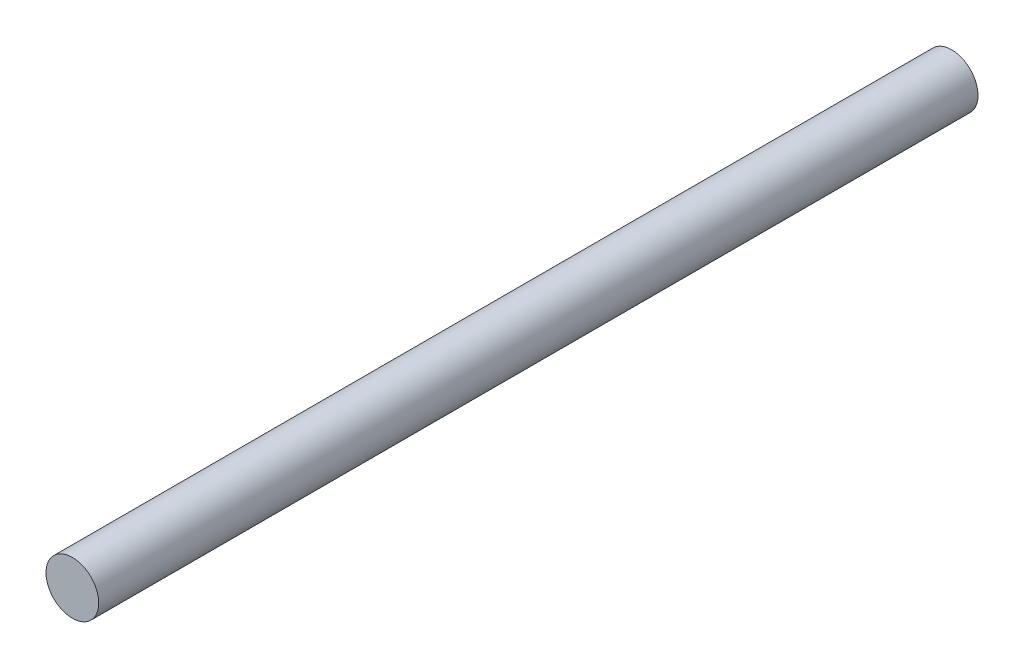
ISO-10303-21;
HEADER;
FILE_DESCRIPTION(('STEP AP214'),'2;1');
FILE_NAME('part.step','',(''),(''),'','','');
FILE_SCHEMA(('AUTOMOTIVE_DESIGN { 1 0 10303 214 1 1 1 1 }'));
ENDSEC;
DATA;
#1=APPLICATION_CONTEXT('core data for automotive mechanical design processes');
#2=APPLICATION_PROTOCOL_DEFINITION('international standard','automotive_design',2000,#1);
#3=PRODUCT_CONTEXT('',#1,'mechanical');
#4=PRODUCT('Part','Part','',(#3));
#5=PRODUCT_RELATED_PRODUCT_CATEGORY('part','',(#4));
#6=PRODUCT_DEFINITION_FORMATION('','',#4);
#7=PRODUCT_DEFINITION_CONTEXT('part definition',#1,'design');
#8=PRODUCT_DEFINITION('design','',#6,#7);
#9=PRODUCT_DEFINITION_SHAPE('','',#8);
#10=(LENGTH_UNIT() NAMED_UNIT(*) SI_UNIT(.MILLI.,.METRE.));
#11=(NAMED_UNIT(*) PLANE_ANGLE_UNIT() SI_UNIT($,.RADIAN.));
#12=(NAMED_UNIT(*) SI_UNIT($,.STERADIAN.) SOLID_ANGLE_UNIT());
#13=UNCERTAINTY_MEASURE_WITH_UNIT(LENGTH_MEASURE(1.E-05),#10,'distance_accuracy_value','');
#14=(GEOMETRIC_REPRESENTATION_CONTEXT(3) GLOBAL_UNCERTAINTY_ASSIGNED_CONTEXT((#13)) GLOBAL_UNIT_ASSIGNED_CONTEXT((#10,
#11,#12)) REPRESENTATION_CONTEXT('',''));
#15=CARTESIAN_POINT('',(0.,0.,0.));
#16=DIRECTION('',(0.,0.,1.));
#17=DIRECTION('',(1.,0.,0.));
#18=AXIS2_PLACEMENT_3D('',#15,#16,#17);
#19=CARTESIAN_POINT('',(4.70803951380108E-12,8.44983805148306E-12,-1458.08355766447));
#20=DIRECTION('',(0.,0.,1.));
#21=DIRECTION('',(0.,-1.,0.));
#22=AXIS2_PLACEMENT_3D('',#19,#20,#21);
#23=CYLINDRICAL_SURFACE('',#22,0.750000000002035);
#24=CARTESIAN_POINT('',(4.70803951380108E-12,8.44983805148306E-12,-1458.08355766447));
#25=DIRECTION('',(0.,0.,-1.));
#26=DIRECTION('',(0.,1.,0.));
#27=AXIS2_PLACEMENT_3D('',#24,#25,#26);
#28=CIRCLE('',#27,0.750000000002035);
#29=CARTESIAN_POINT('',(4.70803951380108E-12,0.750000000010485,-1458.08355766447));
#30=VERTEX_POINT('',#29);
#31=EDGE_CURVE('E10',#30,#30,#28,.T.);
#32=ORIENTED_EDGE('',*,*,#31,.F.);
#33=EDGE_LOOP('',(#32));
#34=FACE_BOUND('',#33,.T.);
#35=CARTESIAN_POINT('',(4.70803951380108E-12,8.44983805148306E-12,-1433.08355766447));
#36=DIRECTION('',(0.,0.,-1.));
#37=DIRECTION('',(0.,1.,0.));
#38=AXIS2_PLACEMENT_3D('',#35,#36,#37);
#39=CIRCLE('',#38,0.750000000002035);
#40=CARTESIAN_POINT('',(4.70803951380108E-12,0.750000000010485,-1433.08355766447));
#41=VERTEX_POINT('',#40);
#42=EDGE_CURVE('E34',#41,#41,#39,.T.);
#43=ORIENTED_EDGE('',*,*,#42,.T.);
#44=EDGE_LOOP('',(#43));
#45=FACE_BOUND('',#44,.T.);
#46=ADVANCED_FACE('F31',(#34,#45),#23,.T.);
#47=CARTESIAN_POINT('',(4.70803951380108E-12,8.44983805148306E-12,-1458.08355766447));
#48=DIRECTION('',(0.,0.,-1.));
#49=DIRECTION('',(0.,1.,0.));
#50=AXIS2_PLACEMENT_3D('',#47,#48,#49);
#51=PLANE('',#50);
#52=ORIENTED_EDGE('',*,*,#31,.T.);
#53=EDGE_LOOP('',(#52));
#54=FACE_BOUND('',#53,.T.);
#55=ADVANCED_FACE('F46',(#54),#51,.T.);
#56=CARTESIAN_POINT('',(4.70803951380108E-12,8.44983805148306E-12,-1433.08355766447));
#57=DIRECTION('',(0.,0.,-1.));
#58=DIRECTION('',(0.,1.,0.));
#59=AXIS2_PLACEMENT_3D('',#56,#57,#58);
#60=PLANE('',#59);
#61=ORIENTED_EDGE('',*,*,#42,.F.);
#62=EDGE_LOOP('',(#61));
#63=FACE_BOUND('',#62,.T.);
#64=ADVANCED_FACE('F44',(#63),#60,.F.);
#65=CLOSED_SHELL('',(#46,#55,#64));
#66=MANIFOLD_SOLID_BREP('B2',#65);
#67=ADVANCED_BREP_SHAPE_REPRESENTATION('',(#18,#66),#14);
#68=SHAPE_DEFINITION_REPRESENTATION(#9,#67);
ENDSEC;
END-ISO-10303-21;
